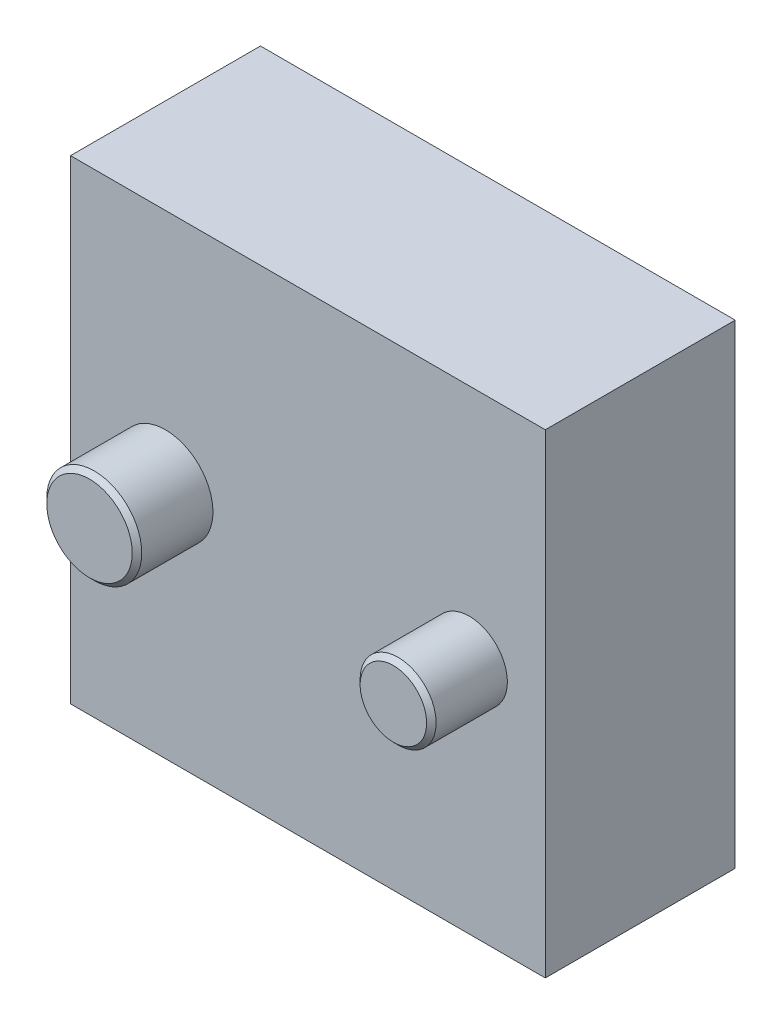
ISO-10303-21;
HEADER;
FILE_DESCRIPTION(('STEP AP214'),'2;1');
FILE_NAME('part.step','',(''),(''),'','','');
FILE_SCHEMA(('AUTOMOTIVE_DESIGN { 1 0 10303 214 1 1 1 1 }'));
ENDSEC;
DATA;
#1=APPLICATION_CONTEXT('core data for automotive mechanical design processes');
#2=APPLICATION_PROTOCOL_DEFINITION('international standard','automotive_design',2000,#1);
#3=PRODUCT_CONTEXT('',#1,'mechanical');
#4=PRODUCT('Part','Part','',(#3));
#5=PRODUCT_RELATED_PRODUCT_CATEGORY('part','',(#4));
#6=PRODUCT_DEFINITION_FORMATION('','',#4);
#7=PRODUCT_DEFINITION_CONTEXT('part definition',#1,'design');
#8=PRODUCT_DEFINITION('design','',#6,#7);
#9=PRODUCT_DEFINITION_SHAPE('','',#8);
#10=(LENGTH_UNIT() NAMED_UNIT(*) SI_UNIT(.MILLI.,.METRE.));
#11=(NAMED_UNIT(*) PLANE_ANGLE_UNIT() SI_UNIT($,.RADIAN.));
#12=(NAMED_UNIT(*) SI_UNIT($,.STERADIAN.) SOLID_ANGLE_UNIT());
#13=UNCERTAINTY_MEASURE_WITH_UNIT(LENGTH_MEASURE(1.E-05),#10,'distance_accuracy_value','');
#14=(GEOMETRIC_REPRESENTATION_CONTEXT(3) GLOBAL_UNCERTAINTY_ASSIGNED_CONTEXT((#13)) GLOBAL_UNIT_ASSIGNED_CONTEXT((#10,
#11,#12)) REPRESENTATION_CONTEXT('',''));
#15=CARTESIAN_POINT('',(0.,0.,0.));
#16=DIRECTION('',(0.,0.,1.));
#17=DIRECTION('',(1.,0.,0.));
#18=AXIS2_PLACEMENT_3D('',#15,#16,#17);
#19=CARTESIAN_POINT('',(25.,-25.,20.));
#20=DIRECTION('',(-1.,0.,0.));
#21=DIRECTION('',(0.,0.,1.));
#22=AXIS2_PLACEMENT_3D('',#19,#20,#21);
#23=PLANE('',#22);
#24=DIRECTION('',(0.,1.,0.));
#25=VECTOR('',#24,1.);
#26=CARTESIAN_POINT('',(25.,-25.,0.));
#27=LINE('',#26,#25);
#28=CARTESIAN_POINT('',(25.,-25.,0.));
#29=VERTEX_POINT('',#28);
#30=CARTESIAN_POINT('',(25.,25.,0.));
#31=VERTEX_POINT('',#30);
#32=EDGE_CURVE('E115',#29,#31,#27,.T.);
#33=ORIENTED_EDGE('',*,*,#32,.T.);
#34=DIRECTION('',(0.,0.,-1.));
#35=VECTOR('',#34,1.);
#36=CARTESIAN_POINT('',(25.,25.,20.));
#37=LINE('',#36,#35);
#38=CARTESIAN_POINT('',(25.,25.,20.));
#39=VERTEX_POINT('',#38);
#40=EDGE_CURVE('E104',#39,#31,#37,.T.);
#41=ORIENTED_EDGE('',*,*,#40,.F.);
#42=DIRECTION('',(0.,1.,0.));
#43=VECTOR('',#42,1.);
#44=CARTESIAN_POINT('',(25.,-25.,20.));
#45=LINE('',#44,#43);
#46=CARTESIAN_POINT('',(25.,-25.,20.));
#47=VERTEX_POINT('',#46);
#48=EDGE_CURVE('E96',#47,#39,#45,.T.);
#49=ORIENTED_EDGE('',*,*,#48,.F.);
#50=DIRECTION('',(0.,0.,-1.));
#51=VECTOR('',#50,1.);
#52=CARTESIAN_POINT('',(25.,-25.,20.));
#53=LINE('',#52,#51);
#54=EDGE_CURVE('E111',#47,#29,#53,.T.);
#55=ORIENTED_EDGE('',*,*,#54,.T.);
#56=EDGE_LOOP('',(#33,#41,#49,#55));
#57=FACE_BOUND('',#56,.T.);
#58=ADVANCED_FACE('F41',(#57),#23,.F.);
#59=CARTESIAN_POINT('',(-25.,25.,20.));
#60=DIRECTION('',(0.,-1.,0.));
#61=DIRECTION('',(0.,0.,-1.));
#62=AXIS2_PLACEMENT_3D('',#59,#60,#61);
#63=PLANE('',#62);
#64=DIRECTION('',(-1.,0.,0.));
#65=VECTOR('',#64,1.);
#66=CARTESIAN_POINT('',(-25.,25.,0.));
#67=LINE('',#66,#65);
#68=CARTESIAN_POINT('',(-25.,25.,0.));
#69=VERTEX_POINT('',#68);
#70=EDGE_CURVE('E102',#31,#69,#67,.T.);
#71=ORIENTED_EDGE('',*,*,#70,.T.);
#72=DIRECTION('',(0.,0.,-1.));
#73=VECTOR('',#72,1.);
#74=CARTESIAN_POINT('',(-25.,25.,20.));
#75=LINE('',#74,#73);
#76=CARTESIAN_POINT('',(-25.,25.,20.));
#77=VERTEX_POINT('',#76);
#78=EDGE_CURVE('E100',#77,#69,#75,.T.);
#79=ORIENTED_EDGE('',*,*,#78,.F.);
#80=DIRECTION('',(-1.,0.,0.));
#81=VECTOR('',#80,1.);
#82=CARTESIAN_POINT('',(-25.,25.,20.));
#83=LINE('',#82,#81);
#84=EDGE_CURVE('E91',#39,#77,#83,.T.);
#85=ORIENTED_EDGE('',*,*,#84,.F.);
#86=ORIENTED_EDGE('',*,*,#40,.T.);
#87=EDGE_LOOP('',(#71,#79,#85,#86));
#88=FACE_BOUND('',#87,.T.);
#89=ADVANCED_FACE('F101',(#88),#63,.F.);
#90=CARTESIAN_POINT('',(-25.,-25.,20.));
#91=DIRECTION('',(1.,0.,0.));
#92=DIRECTION('',(0.,0.,-1.));
#93=AXIS2_PLACEMENT_3D('',#90,#91,#92);
#94=PLANE('',#93);
#95=DIRECTION('',(0.,-1.,0.));
#96=VECTOR('',#95,1.);
#97=CARTESIAN_POINT('',(-25.,-25.,0.));
#98=LINE('',#97,#96);
#99=CARTESIAN_POINT('',(-25.,-25.,0.));
#100=VERTEX_POINT('',#99);
#101=EDGE_CURVE('E77',#69,#100,#98,.T.);
#102=ORIENTED_EDGE('',*,*,#101,.T.);
#103=DIRECTION('',(0.,0.,-1.));
#104=VECTOR('',#103,1.);
#105=CARTESIAN_POINT('',(-25.,-25.,20.));
#106=LINE('',#105,#104);
#107=CARTESIAN_POINT('',(-25.,-25.,20.));
#108=VERTEX_POINT('',#107);
#109=EDGE_CURVE('E105',#108,#100,#106,.T.);
#110=ORIENTED_EDGE('',*,*,#109,.F.);
#111=DIRECTION('',(0.,-1.,0.));
#112=VECTOR('',#111,1.);
#113=CARTESIAN_POINT('',(-25.,-25.,20.));
#114=LINE('',#113,#112);
#115=EDGE_CURVE('E94',#77,#108,#114,.T.);
#116=ORIENTED_EDGE('',*,*,#115,.F.);
#117=ORIENTED_EDGE('',*,*,#78,.T.);
#118=EDGE_LOOP('',(#102,#110,#116,#117));
#119=FACE_BOUND('',#118,.T.);
#120=ADVANCED_FACE('F107',(#119),#94,.F.);
#121=CARTESIAN_POINT('',(-25.,-25.,20.));
#122=DIRECTION('',(0.,1.,0.));
#123=DIRECTION('',(0.,0.,1.));
#124=AXIS2_PLACEMENT_3D('',#121,#122,#123);
#125=PLANE('',#124);
#126=DIRECTION('',(1.,0.,0.));
#127=VECTOR('',#126,1.);
#128=CARTESIAN_POINT('',(-25.,-25.,0.));
#129=LINE('',#128,#127);
#130=EDGE_CURVE('E83',#100,#29,#129,.T.);
#131=ORIENTED_EDGE('',*,*,#130,.T.);
#132=ORIENTED_EDGE('',*,*,#54,.F.);
#133=DIRECTION('',(1.,0.,0.));
#134=VECTOR('',#133,1.);
#135=CARTESIAN_POINT('',(-25.,-25.,20.));
#136=LINE('',#135,#134);
#137=EDGE_CURVE('E60',#108,#47,#136,.T.);
#138=ORIENTED_EDGE('',*,*,#137,.F.);
#139=ORIENTED_EDGE('',*,*,#109,.T.);
#140=EDGE_LOOP('',(#131,#132,#138,#139));
#141=FACE_BOUND('',#140,.T.);
#142=ADVANCED_FACE('F175',(#141),#125,.F.);
#143=CARTESIAN_POINT('',(0.,0.,20.));
#144=DIRECTION('',(0.,0.,-1.));
#145=DIRECTION('',(-1.,0.,0.));
#146=AXIS2_PLACEMENT_3D('',#143,#144,#145);
#147=PLANE('',#146);
#148=CARTESIAN_POINT('',(17.,0.,20.));
#149=DIRECTION('',(0.,0.,-1.));
#150=DIRECTION('',(-1.,0.,0.));
#151=AXIS2_PLACEMENT_3D('',#148,#149,#150);
#152=CIRCLE('',#151,4.);
#153=CARTESIAN_POINT('',(13.,0.,20.));
#154=VERTEX_POINT('',#153);
#155=EDGE_CURVE('E135',#154,#154,#152,.F.);
#156=ORIENTED_EDGE('',*,*,#155,.F.);
#157=EDGE_LOOP('',(#156));
#158=FACE_BOUND('',#157,.T.);
#159=CARTESIAN_POINT('',(-15.,0.,20.));
#160=DIRECTION('',(0.,0.,-1.));
#161=DIRECTION('',(-1.,0.,0.));
#162=AXIS2_PLACEMENT_3D('',#159,#160,#161);
#163=CIRCLE('',#162,5.);
#164=CARTESIAN_POINT('',(-20.,0.,20.));
#165=VERTEX_POINT('',#164);
#166=EDGE_CURVE('E131',#165,#165,#163,.F.);
#167=ORIENTED_EDGE('',*,*,#166,.F.);
#168=EDGE_LOOP('',(#167));
#169=FACE_BOUND('',#168,.T.);
#170=ORIENTED_EDGE('',*,*,#48,.T.);
#171=ORIENTED_EDGE('',*,*,#84,.T.);
#172=ORIENTED_EDGE('',*,*,#115,.T.);
#173=ORIENTED_EDGE('',*,*,#137,.T.);
#174=EDGE_LOOP('',(#170,#171,#172,#173));
#175=FACE_BOUND('',#174,.T.);
#176=ADVANCED_FACE('F92',(#158,#169,#175),#147,.F.);
#177=CARTESIAN_POINT('',(0.,0.,0.));
#178=DIRECTION('',(0.,0.,-1.));
#179=DIRECTION('',(-1.,0.,0.));
#180=AXIS2_PLACEMENT_3D('',#177,#178,#179);
#181=PLANE('',#180);
#182=ORIENTED_EDGE('',*,*,#32,.F.);
#183=ORIENTED_EDGE('',*,*,#130,.F.);
#184=ORIENTED_EDGE('',*,*,#101,.F.);
#185=ORIENTED_EDGE('',*,*,#70,.F.);
#186=EDGE_LOOP('',(#182,#183,#184,#185));
#187=FACE_BOUND('',#186,.T.);
#188=ADVANCED_FACE('F178',(#187),#181,.T.);
#189=CARTESIAN_POINT('',(-15.,0.,28.));
#190=DIRECTION('',(0.,0.,-1.));
#191=DIRECTION('',(-1.,0.,0.));
#192=AXIS2_PLACEMENT_3D('',#189,#190,#191);
#193=CYLINDRICAL_SURFACE('',#192,5.);
#194=CARTESIAN_POINT('',(-15.,0.,27.5));
#195=DIRECTION('',(0.,0.,1.));
#196=DIRECTION('',(1.,0.,0.));
#197=AXIS2_PLACEMENT_3D('',#194,#195,#196);
#198=CIRCLE('',#197,5.);
#199=CARTESIAN_POINT('',(-10.,0.,27.5));
#200=VERTEX_POINT('',#199);
#201=EDGE_CURVE('E143',#200,#200,#198,.F.);
#202=ORIENTED_EDGE('',*,*,#201,.T.);
#203=EDGE_LOOP('',(#202));
#204=FACE_BOUND('',#203,.T.);
#205=ORIENTED_EDGE('',*,*,#166,.T.);
#206=EDGE_LOOP('',(#205));
#207=FACE_BOUND('',#206,.T.);
#208=ADVANCED_FACE('F181',(#204,#207),#193,.T.);
#209=CARTESIAN_POINT('',(-15.,0.,28.));
#210=DIRECTION('',(0.,0.,1.));
#211=DIRECTION('',(1.,0.,0.));
#212=AXIS2_PLACEMENT_3D('',#209,#210,#211);
#213=PLANE('',#212);
#214=CARTESIAN_POINT('',(-15.,0.,28.));
#215=DIRECTION('',(0.,0.,1.));
#216=DIRECTION('',(1.,0.,0.));
#217=AXIS2_PLACEMENT_3D('',#214,#215,#216);
#218=CIRCLE('',#217,4.49999999999999);
#219=CARTESIAN_POINT('',(-10.5,0.,28.));
#220=VERTEX_POINT('',#219);
#221=EDGE_CURVE('E139',#220,#220,#218,.T.);
#222=ORIENTED_EDGE('',*,*,#221,.T.);
#223=EDGE_LOOP('',(#222));
#224=FACE_BOUND('',#223,.T.);
#225=ADVANCED_FACE('F188',(#224),#213,.T.);
#226=CARTESIAN_POINT('',(17.,0.,28.));
#227=DIRECTION('',(0.,0.,-1.));
#228=DIRECTION('',(-1.,0.,0.));
#229=AXIS2_PLACEMENT_3D('',#226,#227,#228);
#230=CYLINDRICAL_SURFACE('',#229,4.);
#231=CARTESIAN_POINT('',(17.,0.,27.5));
#232=DIRECTION('',(0.,0.,1.));
#233=DIRECTION('',(1.,0.,0.));
#234=AXIS2_PLACEMENT_3D('',#231,#232,#233);
#235=CIRCLE('',#234,4.);
#236=CARTESIAN_POINT('',(21.,0.,27.5));
#237=VERTEX_POINT('',#236);
#238=EDGE_CURVE('E11',#237,#237,#235,.F.);
#239=ORIENTED_EDGE('',*,*,#238,.T.);
#240=EDGE_LOOP('',(#239));
#241=FACE_BOUND('',#240,.T.);
#242=ORIENTED_EDGE('',*,*,#155,.T.);
#243=EDGE_LOOP('',(#242));
#244=FACE_BOUND('',#243,.T.);
#245=ADVANCED_FACE('F192',(#241,#244),#230,.T.);
#246=CARTESIAN_POINT('',(17.,0.,28.));
#247=DIRECTION('',(0.,0.,1.));
#248=DIRECTION('',(1.,0.,0.));
#249=AXIS2_PLACEMENT_3D('',#246,#247,#248);
#250=PLANE('',#249);
#251=CARTESIAN_POINT('',(17.,0.,28.));
#252=DIRECTION('',(0.,0.,1.));
#253=DIRECTION('',(1.,0.,0.));
#254=AXIS2_PLACEMENT_3D('',#251,#252,#253);
#255=CIRCLE('',#254,3.5);
#256=CARTESIAN_POINT('',(20.5,0.,28.));
#257=VERTEX_POINT('',#256);
#258=EDGE_CURVE('E52',#257,#257,#255,.T.);
#259=ORIENTED_EDGE('',*,*,#258,.T.);
#260=EDGE_LOOP('',(#259));
#261=FACE_BOUND('',#260,.T.);
#262=ADVANCED_FACE('F150',(#261),#250,.T.);
#263=CARTESIAN_POINT('',(-15.,0.,28.));
#264=DIRECTION('',(0.,0.,-1.));
#265=DIRECTION('',(-1.,0.,0.));
#266=AXIS2_PLACEMENT_3D('',#263,#264,#265);
#267=CONICAL_SURFACE('',#266,4.49999999999999,0.785398163397447);
#268=ORIENTED_EDGE('',*,*,#201,.F.);
#269=EDGE_LOOP('',(#268));
#270=FACE_BOUND('',#269,.T.);
#271=ORIENTED_EDGE('',*,*,#221,.F.);
#272=EDGE_LOOP('',(#271));
#273=FACE_BOUND('',#272,.T.);
#274=ADVANCED_FACE('F153',(#270,#273),#267,.T.);
#275=CARTESIAN_POINT('',(17.,0.,28.));
#276=DIRECTION('',(0.,0.,-1.));
#277=DIRECTION('',(-1.,0.,0.));
#278=AXIS2_PLACEMENT_3D('',#275,#276,#277);
#279=CONICAL_SURFACE('',#278,3.5,0.785398163397444);
#280=ORIENTED_EDGE('',*,*,#238,.F.);
#281=EDGE_LOOP('',(#280));
#282=FACE_BOUND('',#281,.T.);
#283=ORIENTED_EDGE('',*,*,#258,.F.);
#284=EDGE_LOOP('',(#283));
#285=FACE_BOUND('',#284,.T.);
#286=ADVANCED_FACE('F44',(#282,#285),#279,.T.);
#287=CLOSED_SHELL('',(#58,#89,#120,#142,#176,#188,#208,#225,#245,#262,#274,#286));
#288=MANIFOLD_SOLID_BREP('B2',#287);
#289=ADVANCED_BREP_SHAPE_REPRESENTATION('',(#18,#288),#14);
#290=SHAPE_DEFINITION_REPRESENTATION(#9,#289);
ENDSEC;
END-ISO-10303-21;
